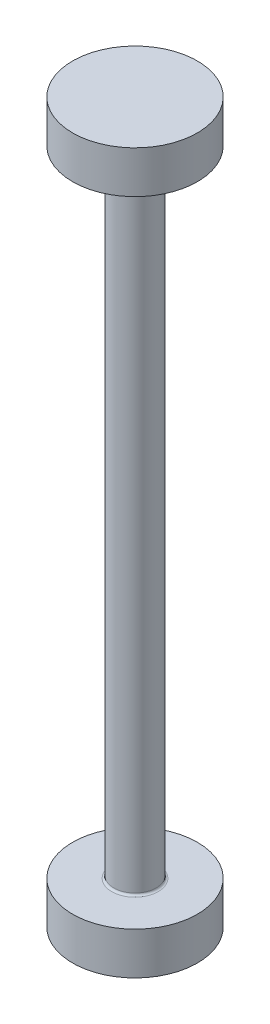
ISO-10303-21;
HEADER;
FILE_DESCRIPTION(('STEP AP214'),'2;1');
FILE_NAME('part.step','',(''),(''),'','','');
FILE_SCHEMA(('AUTOMOTIVE_DESIGN { 1 0 10303 214 1 1 1 1 }'));
ENDSEC;
DATA;
#1=APPLICATION_CONTEXT('core data for automotive mechanical design processes');
#2=APPLICATION_PROTOCOL_DEFINITION('international standard','automotive_design',2000,#1);
#3=PRODUCT_CONTEXT('',#1,'mechanical');
#4=PRODUCT('Part','Part','',(#3));
#5=PRODUCT_RELATED_PRODUCT_CATEGORY('part','',(#4));
#6=PRODUCT_DEFINITION_FORMATION('','',#4);
#7=PRODUCT_DEFINITION_CONTEXT('part definition',#1,'design');
#8=PRODUCT_DEFINITION('design','',#6,#7);
#9=PRODUCT_DEFINITION_SHAPE('','',#8);
#10=(LENGTH_UNIT() NAMED_UNIT(*) SI_UNIT(.MILLI.,.METRE.));
#11=(NAMED_UNIT(*) PLANE_ANGLE_UNIT() SI_UNIT($,.RADIAN.));
#12=(NAMED_UNIT(*) SI_UNIT($,.STERADIAN.) SOLID_ANGLE_UNIT());
#13=UNCERTAINTY_MEASURE_WITH_UNIT(LENGTH_MEASURE(1.E-05),#10,'distance_accuracy_value','');
#14=(GEOMETRIC_REPRESENTATION_CONTEXT(3) GLOBAL_UNCERTAINTY_ASSIGNED_CONTEXT((#13)) GLOBAL_UNIT_ASSIGNED_CONTEXT((#10,
#11,#12)) REPRESENTATION_CONTEXT('',''));
#15=CARTESIAN_POINT('',(0.,0.,0.));
#16=DIRECTION('',(0.,0.,1.));
#17=DIRECTION('',(1.,0.,0.));
#18=AXIS2_PLACEMENT_3D('',#15,#16,#17);
#19=CARTESIAN_POINT('',(0.,1710.10121563789,0.));
#20=DIRECTION('',(0.,-1.,0.));
#21=DIRECTION('',(0.,0.,-1.));
#22=AXIS2_PLACEMENT_3D('',#19,#20,#21);
#23=CYLINDRICAL_SURFACE('',#22,29.5);
#24=CARTESIAN_POINT('',(0.,1710.10121563789,0.));
#25=DIRECTION('',(0.,-1.,0.));
#26=DIRECTION('',(0.,0.,-1.));
#27=AXIS2_PLACEMENT_3D('',#24,#25,#26);
#28=CIRCLE('',#27,29.5);
#29=CARTESIAN_POINT('',(0.,1710.10121563789,-29.5));
#30=VERTEX_POINT('',#29);
#31=EDGE_CURVE('E59',#30,#30,#28,.T.);
#32=ORIENTED_EDGE('',*,*,#31,.T.);
#33=EDGE_LOOP('',(#32));
#34=FACE_BOUND('',#33,.T.);
#35=CARTESIAN_POINT('',(0.,1690.10121563789,0.));
#36=DIRECTION('',(0.,-1.,0.));
#37=DIRECTION('',(0.,0.,-1.));
#38=AXIS2_PLACEMENT_3D('',#35,#36,#37);
#39=CIRCLE('',#38,29.5);
#40=CARTESIAN_POINT('',(0.,1690.10121563789,-29.5));
#41=VERTEX_POINT('',#40);
#42=EDGE_CURVE('E60',#41,#41,#39,.T.);
#43=ORIENTED_EDGE('',*,*,#42,.F.);
#44=EDGE_LOOP('',(#43));
#45=FACE_BOUND('',#44,.T.);
#46=ADVANCED_FACE('F39',(#34,#45),#23,.T.);
#47=CARTESIAN_POINT('',(0.,1710.10121563789,0.));
#48=DIRECTION('',(0.,-1.,0.));
#49=DIRECTION('',(0.,0.,-1.));
#50=AXIS2_PLACEMENT_3D('',#47,#48,#49);
#51=PLANE('',#50);
#52=CARTESIAN_POINT('',(0.,1710.10121563789,0.));
#53=DIRECTION('',(0.,-1.,0.));
#54=DIRECTION('',(0.,0.,-1.));
#55=AXIS2_PLACEMENT_3D('',#52,#53,#54);
#56=CIRCLE('',#55,10.9999999999507);
#57=CARTESIAN_POINT('',(0.,1710.10121563789,-10.9999999999507));
#58=VERTEX_POINT('',#57);
#59=EDGE_CURVE('E46',#58,#58,#56,.T.);
#60=ORIENTED_EDGE('',*,*,#59,.T.);
#61=EDGE_LOOP('',(#60));
#62=FACE_BOUND('',#61,.T.);
#63=ORIENTED_EDGE('',*,*,#31,.F.);
#64=EDGE_LOOP('',(#63));
#65=FACE_BOUND('',#64,.T.);
#66=ADVANCED_FACE('F93',(#62,#65),#51,.F.);
#67=CARTESIAN_POINT('',(0.,1690.10121563789,0.));
#68=DIRECTION('',(0.,-1.,0.));
#69=DIRECTION('',(0.,0.,-1.));
#70=AXIS2_PLACEMENT_3D('',#67,#68,#69);
#71=PLANE('',#70);
#72=ORIENTED_EDGE('',*,*,#42,.T.);
#73=EDGE_LOOP('',(#72));
#74=FACE_BOUND('',#73,.T.);
#75=ADVANCED_FACE('F100',(#74),#71,.T.);
#76=CARTESIAN_POINT('',(0.,2010.10121563789,0.));
#77=DIRECTION('',(0.,-1.,0.));
#78=DIRECTION('',(0.,0.,-1.));
#79=AXIS2_PLACEMENT_3D('',#76,#77,#78);
#80=CYLINDRICAL_SURFACE('',#79,9.99999999995073);
#81=CARTESIAN_POINT('',(0.,1711.10121563789,0.));
#82=DIRECTION('',(0.,-1.,0.));
#83=DIRECTION('',(0.,0.,-1.));
#84=AXIS2_PLACEMENT_3D('',#81,#82,#83);
#85=CIRCLE('',#84,9.99999999995073);
#86=CARTESIAN_POINT('',(0.,1711.10121563789,-9.99999999995073));
#87=VERTEX_POINT('',#86);
#88=EDGE_CURVE('E50',#87,#87,#85,.F.);
#89=ORIENTED_EDGE('',*,*,#88,.T.);
#90=EDGE_LOOP('',(#89));
#91=FACE_BOUND('',#90,.T.);
#92=CARTESIAN_POINT('',(0.,2009.10121563789,0.));
#93=DIRECTION('',(0.,1.,0.));
#94=DIRECTION('',(0.,0.,1.));
#95=AXIS2_PLACEMENT_3D('',#92,#93,#94);
#96=CIRCLE('',#95,9.99999999995073);
#97=CARTESIAN_POINT('',(0.,2009.10121563789,9.99999999995073));
#98=VERTEX_POINT('',#97);
#99=EDGE_CURVE('E54',#98,#98,#96,.F.);
#100=ORIENTED_EDGE('',*,*,#99,.T.);
#101=EDGE_LOOP('',(#100));
#102=FACE_BOUND('',#101,.T.);
#103=ADVANCED_FACE('F77',(#91,#102),#80,.T.);
#104=CARTESIAN_POINT('',(0.,2030.10121563789,0.));
#105=DIRECTION('',(0.,-1.,0.));
#106=DIRECTION('',(0.,0.,-1.));
#107=AXIS2_PLACEMENT_3D('',#104,#105,#106);
#108=CYLINDRICAL_SURFACE('',#107,29.5);
#109=CARTESIAN_POINT('',(0.,2030.10121563789,0.));
#110=DIRECTION('',(0.,1.,0.));
#111=DIRECTION('',(0.,0.,1.));
#112=AXIS2_PLACEMENT_3D('',#109,#110,#111);
#113=CIRCLE('',#112,29.5);
#114=CARTESIAN_POINT('',(0.,2030.10121563789,29.5));
#115=VERTEX_POINT('',#114);
#116=EDGE_CURVE('E63',#115,#115,#113,.T.);
#117=ORIENTED_EDGE('',*,*,#116,.F.);
#118=EDGE_LOOP('',(#117));
#119=FACE_BOUND('',#118,.T.);
#120=CARTESIAN_POINT('',(0.,2010.10121563789,0.));
#121=DIRECTION('',(0.,1.,0.));
#122=DIRECTION('',(0.,0.,1.));
#123=AXIS2_PLACEMENT_3D('',#120,#121,#122);
#124=CIRCLE('',#123,29.5);
#125=CARTESIAN_POINT('',(0.,2010.10121563789,29.5));
#126=VERTEX_POINT('',#125);
#127=EDGE_CURVE('E66',#126,#126,#124,.T.);
#128=ORIENTED_EDGE('',*,*,#127,.T.);
#129=EDGE_LOOP('',(#128));
#130=FACE_BOUND('',#129,.T.);
#131=ADVANCED_FACE('F74',(#119,#130),#108,.T.);
#132=CARTESIAN_POINT('',(0.,2030.10121563789,0.));
#133=DIRECTION('',(0.,1.,0.));
#134=DIRECTION('',(0.,0.,1.));
#135=AXIS2_PLACEMENT_3D('',#132,#133,#134);
#136=PLANE('',#135);
#137=ORIENTED_EDGE('',*,*,#116,.T.);
#138=EDGE_LOOP('',(#137));
#139=FACE_BOUND('',#138,.T.);
#140=ADVANCED_FACE('F72',(#139),#136,.T.);
#141=CARTESIAN_POINT('',(0.,2010.10121563789,0.));
#142=DIRECTION('',(0.,1.,0.));
#143=DIRECTION('',(0.,0.,1.));
#144=AXIS2_PLACEMENT_3D('',#141,#142,#143);
#145=PLANE('',#144);
#146=CARTESIAN_POINT('',(0.,2010.10121563789,0.));
#147=DIRECTION('',(0.,1.,0.));
#148=DIRECTION('',(0.,0.,1.));
#149=AXIS2_PLACEMENT_3D('',#146,#147,#148);
#150=CIRCLE('',#149,10.9999999999507);
#151=CARTESIAN_POINT('',(0.,2010.10121563789,10.9999999999507));
#152=VERTEX_POINT('',#151);
#153=EDGE_CURVE('E10',#152,#152,#150,.T.);
#154=ORIENTED_EDGE('',*,*,#153,.T.);
#155=EDGE_LOOP('',(#154));
#156=FACE_BOUND('',#155,.T.);
#157=ORIENTED_EDGE('',*,*,#127,.F.);
#158=EDGE_LOOP('',(#157));
#159=FACE_BOUND('',#158,.T.);
#160=ADVANCED_FACE('F81',(#156,#159),#145,.F.);
#161=CARTESIAN_POINT('',(0.,1711.10121563789,0.));
#162=DIRECTION('',(0.,-1.,0.));
#163=DIRECTION('',(0.,0.,-1.));
#164=AXIS2_PLACEMENT_3D('',#161,#162,#163);
#165=TOROIDAL_SURFACE('',#164,10.9999999999507,1.);
#166=ORIENTED_EDGE('',*,*,#59,.F.);
#167=EDGE_LOOP('',(#166));
#168=FACE_BOUND('',#167,.T.);
#169=ORIENTED_EDGE('',*,*,#88,.F.);
#170=EDGE_LOOP('',(#169));
#171=FACE_BOUND('',#170,.T.);
#172=ADVANCED_FACE('F83',(#168,#171),#165,.F.);
#173=CARTESIAN_POINT('',(0.,2009.10121563789,0.));
#174=DIRECTION('',(0.,1.,0.));
#175=DIRECTION('',(0.,0.,1.));
#176=AXIS2_PLACEMENT_3D('',#173,#174,#175);
#177=TOROIDAL_SURFACE('',#176,10.9999999999507,1.);
#178=ORIENTED_EDGE('',*,*,#99,.F.);
#179=EDGE_LOOP('',(#178));
#180=FACE_BOUND('',#179,.T.);
#181=ORIENTED_EDGE('',*,*,#153,.F.);
#182=EDGE_LOOP('',(#181));
#183=FACE_BOUND('',#182,.T.);
#184=ADVANCED_FACE('F41',(#180,#183),#177,.F.);
#185=CLOSED_SHELL('',(#46,#66,#75,#103,#131,#140,#160,#172,#184));
#186=MANIFOLD_SOLID_BREP('B2',#185);
#187=ADVANCED_BREP_SHAPE_REPRESENTATION('',(#18,#186),#14);
#188=SHAPE_DEFINITION_REPRESENTATION(#9,#187);
ENDSEC;
END-ISO-10303-21;
